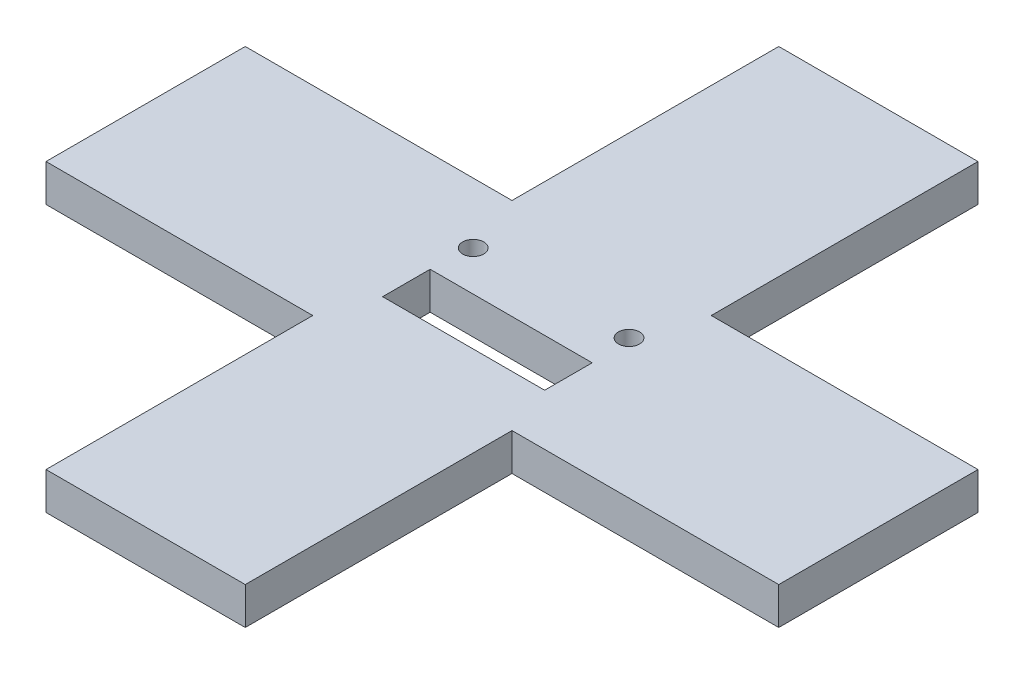
ISO-10303-21;
HEADER;
FILE_DESCRIPTION(('STEP AP214'),'2;1');
FILE_NAME('part.step','',(''),(''),'','','');
FILE_SCHEMA(('AUTOMOTIVE_DESIGN { 1 0 10303 214 1 1 1 1 }'));
ENDSEC;
DATA;
#1=APPLICATION_CONTEXT('core data for automotive mechanical design processes');
#2=APPLICATION_PROTOCOL_DEFINITION('international standard','automotive_design',2000,#1);
#3=PRODUCT_CONTEXT('',#1,'mechanical');
#4=PRODUCT('Part','Part','',(#3));
#5=PRODUCT_RELATED_PRODUCT_CATEGORY('part','',(#4));
#6=PRODUCT_DEFINITION_FORMATION('','',#4);
#7=PRODUCT_DEFINITION_CONTEXT('part definition',#1,'design');
#8=PRODUCT_DEFINITION('design','',#6,#7);
#9=PRODUCT_DEFINITION_SHAPE('','',#8);
#10=(LENGTH_UNIT() NAMED_UNIT(*) SI_UNIT(.MILLI.,.METRE.));
#11=(NAMED_UNIT(*) PLANE_ANGLE_UNIT() SI_UNIT($,.RADIAN.));
#12=(NAMED_UNIT(*) SI_UNIT($,.STERADIAN.) SOLID_ANGLE_UNIT());
#13=UNCERTAINTY_MEASURE_WITH_UNIT(LENGTH_MEASURE(1.E-05),#10,'distance_accuracy_value','');
#14=(GEOMETRIC_REPRESENTATION_CONTEXT(3) GLOBAL_UNCERTAINTY_ASSIGNED_CONTEXT((#13)) GLOBAL_UNIT_ASSIGNED_CONTEXT((#10,
#11,#12)) REPRESENTATION_CONTEXT('',''));
#15=CARTESIAN_POINT('',(0.,0.,0.));
#16=DIRECTION('',(0.,0.,1.));
#17=DIRECTION('',(1.,0.,0.));
#18=AXIS2_PLACEMENT_3D('',#15,#16,#17);
#19=CARTESIAN_POINT('',(0.,6.,0.));
#20=DIRECTION('',(0.,1.,0.));
#21=DIRECTION('',(0.,0.,1.));
#22=AXIS2_PLACEMENT_3D('',#19,#20,#21);
#23=PLANE('',#22);
#24=CARTESIAN_POINT('',(-12.56,6.,-6.44));
#25=DIRECTION('',(0.,1.,0.));
#26=DIRECTION('',(0.,0.,1.));
#27=AXIS2_PLACEMENT_3D('',#24,#25,#26);
#28=CIRCLE('',#27,1.7);
#29=CARTESIAN_POINT('',(-12.56,6.,-4.74));
#30=VERTEX_POINT('',#29);
#31=EDGE_CURVE('E188',#30,#30,#28,.T.);
#32=ORIENTED_EDGE('',*,*,#31,.F.);
#33=EDGE_LOOP('',(#32));
#34=FACE_BOUND('',#33,.T.);
#35=DIRECTION('',(-1.,0.,0.));
#36=VECTOR('',#35,1.);
#37=CARTESIAN_POINT('',(16.0572409144759,6.,-59.199662960896));
#38=LINE('',#37,#36);
#39=CARTESIAN_POINT('',(16.0572409144759,6.,-59.199662960896));
#40=VERTEX_POINT('',#39);
#41=CARTESIAN_POINT('',(-16.0627590855242,6.,-59.199662960896));
#42=VERTEX_POINT('',#41);
#43=EDGE_CURVE('E204',#40,#42,#38,.T.);
#44=ORIENTED_EDGE('',*,*,#43,.T.);
#45=DIRECTION('',(0.,0.,1.));
#46=VECTOR('',#45,1.);
#47=CARTESIAN_POINT('',(-16.0627590855242,6.,-59.199662960896));
#48=LINE('',#47,#46);
#49=CARTESIAN_POINT('',(-16.0627590855241,6.,-16.199662960896));
#50=VERTEX_POINT('',#49);
#51=EDGE_CURVE('E207',#42,#50,#48,.T.);
#52=ORIENTED_EDGE('',*,*,#51,.T.);
#53=DIRECTION('',(-1.,0.,0.));
#54=VECTOR('',#53,1.);
#55=CARTESIAN_POINT('',(-16.0627590855241,6.,-16.199662960896));
#56=LINE('',#55,#54);
#57=CARTESIAN_POINT('',(-59.0627590855241,6.,-16.199662960896));
#58=VERTEX_POINT('',#57);
#59=EDGE_CURVE('E211',#50,#58,#56,.T.);
#60=ORIENTED_EDGE('',*,*,#59,.T.);
#61=DIRECTION('',(0.,0.,1.));
#62=VECTOR('',#61,1.);
#63=CARTESIAN_POINT('',(-59.0627590855241,6.,-0.13966296089599));
#64=LINE('',#63,#62);
#65=CARTESIAN_POINT('',(-59.0627590855241,6.,15.920337039104));
#66=VERTEX_POINT('',#65);
#67=EDGE_CURVE('E214',#58,#66,#64,.T.);
#68=ORIENTED_EDGE('',*,*,#67,.T.);
#69=DIRECTION('',(1.,0.,0.));
#70=VECTOR('',#69,1.);
#71=CARTESIAN_POINT('',(-59.0627590855241,6.,15.920337039104));
#72=LINE('',#71,#70);
#73=CARTESIAN_POINT('',(-16.0627590855241,6.,15.920337039104));
#74=VERTEX_POINT('',#73);
#75=EDGE_CURVE('E217',#66,#74,#72,.T.);
#76=ORIENTED_EDGE('',*,*,#75,.T.);
#77=DIRECTION('',(0.,0.,1.));
#78=VECTOR('',#77,1.);
#79=CARTESIAN_POINT('',(-16.0627590855241,6.,15.920337039104));
#80=LINE('',#79,#78);
#81=CARTESIAN_POINT('',(-16.0627590855241,6.,58.920337039104));
#82=VERTEX_POINT('',#81);
#83=EDGE_CURVE('E220',#74,#82,#80,.T.);
#84=ORIENTED_EDGE('',*,*,#83,.T.);
#85=DIRECTION('',(1.,0.,0.));
#86=VECTOR('',#85,1.);
#87=CARTESIAN_POINT('',(-16.0627590855241,6.,58.920337039104));
#88=LINE('',#87,#86);
#89=CARTESIAN_POINT('',(16.0572409144759,6.,58.920337039104));
#90=VERTEX_POINT('',#89);
#91=EDGE_CURVE('E223',#82,#90,#88,.T.);
#92=ORIENTED_EDGE('',*,*,#91,.T.);
#93=DIRECTION('',(0.,0.,-1.));
#94=VECTOR('',#93,1.);
#95=CARTESIAN_POINT('',(16.0572409144759,6.,58.920337039104));
#96=LINE('',#95,#94);
#97=CARTESIAN_POINT('',(16.0572409144759,6.,15.920337039104));
#98=VERTEX_POINT('',#97);
#99=EDGE_CURVE('E226',#90,#98,#96,.T.);
#100=ORIENTED_EDGE('',*,*,#99,.T.);
#101=DIRECTION('',(1.,0.,0.));
#102=VECTOR('',#101,1.);
#103=CARTESIAN_POINT('',(16.0572409144759,6.,15.920337039104));
#104=LINE('',#103,#102);
#105=CARTESIAN_POINT('',(59.0572409144759,6.,15.920337039104));
#106=VERTEX_POINT('',#105);
#107=EDGE_CURVE('E229',#98,#106,#104,.T.);
#108=ORIENTED_EDGE('',*,*,#107,.T.);
#109=DIRECTION('',(0.,0.,-1.));
#110=VECTOR('',#109,1.);
#111=CARTESIAN_POINT('',(59.0572409144759,6.,-0.139662960895987));
#112=LINE('',#111,#110);
#113=CARTESIAN_POINT('',(59.0572409144759,6.,-16.199662960896));
#114=VERTEX_POINT('',#113);
#115=EDGE_CURVE('E232',#106,#114,#112,.T.);
#116=ORIENTED_EDGE('',*,*,#115,.T.);
#117=DIRECTION('',(-1.,0.,0.));
#118=VECTOR('',#117,1.);
#119=CARTESIAN_POINT('',(59.0572409144759,6.,-16.199662960896));
#120=LINE('',#119,#118);
#121=CARTESIAN_POINT('',(16.0572409144759,6.,-16.199662960896));
#122=VERTEX_POINT('',#121);
#123=EDGE_CURVE('E235',#114,#122,#120,.T.);
#124=ORIENTED_EDGE('',*,*,#123,.T.);
#125=DIRECTION('',(0.,0.,-1.));
#126=VECTOR('',#125,1.);
#127=CARTESIAN_POINT('',(16.0572409144759,6.,-16.199662960896));
#128=LINE('',#127,#126);
#129=EDGE_CURVE('E238',#122,#40,#128,.T.);
#130=ORIENTED_EDGE('',*,*,#129,.T.);
#131=EDGE_LOOP('',(#44,#52,#60,#68,#76,#84,#92,#100,#108,#116,#124,#130));
#132=FACE_BOUND('',#131,.T.);
#133=DIRECTION('',(1.,0.,0.));
#134=VECTOR('',#133,1.);
#135=CARTESIAN_POINT('',(13.06,6.,7.66));
#136=LINE('',#135,#134);
#137=CARTESIAN_POINT('',(-13.06,6.,7.66));
#138=VERTEX_POINT('',#137);
#139=CARTESIAN_POINT('',(13.06,6.,7.66));
#140=VERTEX_POINT('',#139);
#141=EDGE_CURVE('E162',#138,#140,#136,.T.);
#142=ORIENTED_EDGE('',*,*,#141,.F.);
#143=DIRECTION('',(0.,0.,1.));
#144=VECTOR('',#143,1.);
#145=CARTESIAN_POINT('',(-13.06,6.,7.66));
#146=LINE('',#145,#144);
#147=CARTESIAN_POINT('',(-13.06,6.,0.));
#148=VERTEX_POINT('',#147);
#149=EDGE_CURVE('E153',#148,#138,#146,.T.);
#150=ORIENTED_EDGE('',*,*,#149,.F.);
#151=DIRECTION('',(-1.,0.,0.));
#152=VECTOR('',#151,1.);
#153=CARTESIAN_POINT('',(13.06,6.,0.));
#154=LINE('',#153,#152);
#155=CARTESIAN_POINT('',(13.06,6.,0.));
#156=VERTEX_POINT('',#155);
#157=EDGE_CURVE('E180',#156,#148,#154,.T.);
#158=ORIENTED_EDGE('',*,*,#157,.F.);
#159=DIRECTION('',(0.,0.,-1.));
#160=VECTOR('',#159,1.);
#161=CARTESIAN_POINT('',(13.06,6.,7.66));
#162=LINE('',#161,#160);
#163=EDGE_CURVE('E176',#140,#156,#162,.T.);
#164=ORIENTED_EDGE('',*,*,#163,.F.);
#165=EDGE_LOOP('',(#142,#150,#158,#164));
#166=FACE_BOUND('',#165,.T.);
#167=CARTESIAN_POINT('',(12.56,6.,-6.44));
#168=DIRECTION('',(0.,1.,0.));
#169=DIRECTION('',(0.,0.,1.));
#170=AXIS2_PLACEMENT_3D('',#167,#168,#169);
#171=CIRCLE('',#170,1.7);
#172=CARTESIAN_POINT('',(12.56,6.,-4.74));
#173=VERTEX_POINT('',#172);
#174=EDGE_CURVE('E561',#173,#173,#171,.T.);
#175=ORIENTED_EDGE('',*,*,#174,.F.);
#176=EDGE_LOOP('',(#175));
#177=FACE_BOUND('',#176,.T.);
#178=ADVANCED_FACE('F39',(#34,#132,#166,#177),#23,.T.);
#179=CARTESIAN_POINT('',(0.,0.,0.));
#180=DIRECTION('',(0.,1.,0.));
#181=DIRECTION('',(0.,0.,1.));
#182=AXIS2_PLACEMENT_3D('',#179,#180,#181);
#183=PLANE('',#182);
#184=DIRECTION('',(-1.,0.,0.));
#185=VECTOR('',#184,1.);
#186=CARTESIAN_POINT('',(-0.00275908552412399,0.,-59.199662960896));
#187=LINE('',#186,#185);
#188=CARTESIAN_POINT('',(16.0572409144759,0.,-59.199662960896));
#189=VERTEX_POINT('',#188);
#190=CARTESIAN_POINT('',(-16.0627590855242,0.,-59.199662960896));
#191=VERTEX_POINT('',#190);
#192=EDGE_CURVE('E171',#189,#191,#187,.T.);
#193=ORIENTED_EDGE('',*,*,#192,.F.);
#194=DIRECTION('',(0.,0.,-1.));
#195=VECTOR('',#194,1.);
#196=CARTESIAN_POINT('',(16.0572409144759,0.,-16.199662960896));
#197=LINE('',#196,#195);
#198=CARTESIAN_POINT('',(16.0572409144759,0.,-16.199662960896));
#199=VERTEX_POINT('',#198);
#200=EDGE_CURVE('E208',#199,#189,#197,.T.);
#201=ORIENTED_EDGE('',*,*,#200,.F.);
#202=DIRECTION('',(-1.,0.,0.));
#203=VECTOR('',#202,1.);
#204=CARTESIAN_POINT('',(59.0572409144759,0.,-16.199662960896));
#205=LINE('',#204,#203);
#206=CARTESIAN_POINT('',(59.0572409144759,0.,-16.199662960896));
#207=VERTEX_POINT('',#206);
#208=EDGE_CURVE('E274',#207,#199,#205,.T.);
#209=ORIENTED_EDGE('',*,*,#208,.F.);
#210=DIRECTION('',(0.,0.,-1.));
#211=VECTOR('',#210,1.);
#212=CARTESIAN_POINT('',(59.0572409144759,0.,-0.139662960895987));
#213=LINE('',#212,#211);
#214=CARTESIAN_POINT('',(59.0572409144759,0.,15.920337039104));
#215=VERTEX_POINT('',#214);
#216=EDGE_CURVE('E271',#215,#207,#213,.T.);
#217=ORIENTED_EDGE('',*,*,#216,.F.);
#218=DIRECTION('',(1.,0.,0.));
#219=VECTOR('',#218,1.);
#220=CARTESIAN_POINT('',(16.0572409144759,0.,15.920337039104));
#221=LINE('',#220,#219);
#222=CARTESIAN_POINT('',(16.0572409144759,0.,15.920337039104));
#223=VERTEX_POINT('',#222);
#224=EDGE_CURVE('E267',#223,#215,#221,.T.);
#225=ORIENTED_EDGE('',*,*,#224,.F.);
#226=DIRECTION('',(0.,0.,-1.));
#227=VECTOR('',#226,1.);
#228=CARTESIAN_POINT('',(16.0572409144759,0.,58.920337039104));
#229=LINE('',#228,#227);
#230=CARTESIAN_POINT('',(16.0572409144759,0.,58.920337039104));
#231=VERTEX_POINT('',#230);
#232=EDGE_CURVE('E264',#231,#223,#229,.T.);
#233=ORIENTED_EDGE('',*,*,#232,.F.);
#234=DIRECTION('',(1.,0.,0.));
#235=VECTOR('',#234,1.);
#236=CARTESIAN_POINT('',(-0.00275908552412399,0.,58.920337039104));
#237=LINE('',#236,#235);
#238=CARTESIAN_POINT('',(-16.0627590855241,0.,58.920337039104));
#239=VERTEX_POINT('',#238);
#240=EDGE_CURVE('E261',#239,#231,#237,.T.);
#241=ORIENTED_EDGE('',*,*,#240,.F.);
#242=DIRECTION('',(0.,0.,1.));
#243=VECTOR('',#242,1.);
#244=CARTESIAN_POINT('',(-16.0627590855241,0.,15.920337039104));
#245=LINE('',#244,#243);
#246=CARTESIAN_POINT('',(-16.0627590855241,0.,15.920337039104));
#247=VERTEX_POINT('',#246);
#248=EDGE_CURVE('E257',#247,#239,#245,.T.);
#249=ORIENTED_EDGE('',*,*,#248,.F.);
#250=DIRECTION('',(1.,0.,0.));
#251=VECTOR('',#250,1.);
#252=CARTESIAN_POINT('',(-59.0627590855241,0.,15.920337039104));
#253=LINE('',#252,#251);
#254=CARTESIAN_POINT('',(-59.0627590855241,0.,15.920337039104));
#255=VERTEX_POINT('',#254);
#256=EDGE_CURVE('E254',#255,#247,#253,.T.);
#257=ORIENTED_EDGE('',*,*,#256,.F.);
#258=DIRECTION('',(0.,0.,1.));
#259=VECTOR('',#258,1.);
#260=CARTESIAN_POINT('',(-59.0627590855241,0.,15.920337039104));
#261=LINE('',#260,#259);
#262=CARTESIAN_POINT('',(-59.0627590855241,0.,-16.199662960896));
#263=VERTEX_POINT('',#262);
#264=EDGE_CURVE('E251',#263,#255,#261,.T.);
#265=ORIENTED_EDGE('',*,*,#264,.F.);
#266=DIRECTION('',(-1.,0.,0.));
#267=VECTOR('',#266,1.);
#268=CARTESIAN_POINT('',(-16.0627590855241,0.,-16.199662960896));
#269=LINE('',#268,#267);
#270=CARTESIAN_POINT('',(-16.0627590855241,0.,-16.199662960896));
#271=VERTEX_POINT('',#270);
#272=EDGE_CURVE('E247',#271,#263,#269,.T.);
#273=ORIENTED_EDGE('',*,*,#272,.F.);
#274=DIRECTION('',(0.,0.,1.));
#275=VECTOR('',#274,1.);
#276=CARTESIAN_POINT('',(-16.0627590855242,0.,-59.199662960896));
#277=LINE('',#276,#275);
#278=EDGE_CURVE('E244',#191,#271,#277,.T.);
#279=ORIENTED_EDGE('',*,*,#278,.F.);
#280=EDGE_LOOP('',(#193,#201,#209,#217,#225,#233,#241,#249,#257,#265,#273,#279));
#281=FACE_BOUND('',#280,.T.);
#282=DIRECTION('',(0.,0.,1.));
#283=VECTOR('',#282,1.);
#284=CARTESIAN_POINT('',(-13.06,0.,7.66));
#285=LINE('',#284,#283);
#286=CARTESIAN_POINT('',(-13.06,0.,0.));
#287=VERTEX_POINT('',#286);
#288=CARTESIAN_POINT('',(-13.06,0.,7.66));
#289=VERTEX_POINT('',#288);
#290=EDGE_CURVE('E63',#287,#289,#285,.T.);
#291=ORIENTED_EDGE('',*,*,#290,.T.);
#292=DIRECTION('',(1.,0.,0.));
#293=VECTOR('',#292,1.);
#294=CARTESIAN_POINT('',(13.06,0.,7.66));
#295=LINE('',#294,#293);
#296=CARTESIAN_POINT('',(13.06,0.,7.66));
#297=VERTEX_POINT('',#296);
#298=EDGE_CURVE('E169',#289,#297,#295,.T.);
#299=ORIENTED_EDGE('',*,*,#298,.T.);
#300=DIRECTION('',(0.,0.,-1.));
#301=VECTOR('',#300,1.);
#302=CARTESIAN_POINT('',(13.06,0.,7.66));
#303=LINE('',#302,#301);
#304=CARTESIAN_POINT('',(13.06,0.,0.));
#305=VERTEX_POINT('',#304);
#306=EDGE_CURVE('E191',#297,#305,#303,.T.);
#307=ORIENTED_EDGE('',*,*,#306,.T.);
#308=DIRECTION('',(-1.,0.,0.));
#309=VECTOR('',#308,1.);
#310=CARTESIAN_POINT('',(13.06,0.,0.));
#311=LINE('',#310,#309);
#312=EDGE_CURVE('E163',#305,#287,#311,.T.);
#313=ORIENTED_EDGE('',*,*,#312,.T.);
#314=EDGE_LOOP('',(#291,#299,#307,#313));
#315=FACE_BOUND('',#314,.T.);
#316=CARTESIAN_POINT('',(-12.56,0.,-6.44));
#317=DIRECTION('',(0.,1.,0.));
#318=DIRECTION('',(0.,0.,1.));
#319=AXIS2_PLACEMENT_3D('',#316,#317,#318);
#320=CIRCLE('',#319,1.7);
#321=CARTESIAN_POINT('',(-12.56,0.,-4.74));
#322=VERTEX_POINT('',#321);
#323=EDGE_CURVE('E569',#322,#322,#320,.T.);
#324=ORIENTED_EDGE('',*,*,#323,.T.);
#325=EDGE_LOOP('',(#324));
#326=FACE_BOUND('',#325,.T.);
#327=CARTESIAN_POINT('',(12.56,0.,-6.44));
#328=DIRECTION('',(0.,1.,0.));
#329=DIRECTION('',(0.,0.,1.));
#330=AXIS2_PLACEMENT_3D('',#327,#328,#329);
#331=CIRCLE('',#330,1.7);
#332=CARTESIAN_POINT('',(12.56,0.,-4.74));
#333=VERTEX_POINT('',#332);
#334=EDGE_CURVE('E564',#333,#333,#331,.T.);
#335=ORIENTED_EDGE('',*,*,#334,.T.);
#336=EDGE_LOOP('',(#335));
#337=FACE_BOUND('',#336,.T.);
#338=ADVANCED_FACE('F330',(#281,#315,#326,#337),#183,.F.);
#339=CARTESIAN_POINT('',(-0.00275908552412399,6.,-59.199662960896));
#340=DIRECTION('',(0.,0.,1.));
#341=DIRECTION('',(1.,0.,0.));
#342=AXIS2_PLACEMENT_3D('',#339,#340,#341);
#343=PLANE('',#342);
#344=ORIENTED_EDGE('',*,*,#192,.T.);
#345=DIRECTION('',(0.,-1.,0.));
#346=VECTOR('',#345,1.);
#347=CARTESIAN_POINT('',(-16.0627590855242,6.,-59.199662960896));
#348=LINE('',#347,#346);
#349=EDGE_CURVE('E11',#42,#191,#348,.T.);
#350=ORIENTED_EDGE('',*,*,#349,.F.);
#351=ORIENTED_EDGE('',*,*,#43,.F.);
#352=DIRECTION('',(0.,-1.,0.));
#353=VECTOR('',#352,1.);
#354=CARTESIAN_POINT('',(16.0572409144759,6.,-59.199662960896));
#355=LINE('',#354,#353);
#356=EDGE_CURVE('E241',#40,#189,#355,.T.);
#357=ORIENTED_EDGE('',*,*,#356,.T.);
#358=EDGE_LOOP('',(#344,#350,#351,#357));
#359=FACE_BOUND('',#358,.T.);
#360=ADVANCED_FACE('F41',(#359),#343,.F.);
#361=CARTESIAN_POINT('',(-16.0627590855242,6.,-59.199662960896));
#362=DIRECTION('',(1.,0.,0.));
#363=DIRECTION('',(0.,0.,-1.));
#364=AXIS2_PLACEMENT_3D('',#361,#362,#363);
#365=PLANE('',#364);
#366=ORIENTED_EDGE('',*,*,#278,.T.);
#367=DIRECTION('',(0.,-1.,0.));
#368=VECTOR('',#367,1.);
#369=CARTESIAN_POINT('',(-16.0627590855241,6.,-16.199662960896));
#370=LINE('',#369,#368);
#371=EDGE_CURVE('E48',#50,#271,#370,.T.);
#372=ORIENTED_EDGE('',*,*,#371,.F.);
#373=ORIENTED_EDGE('',*,*,#51,.F.);
#374=ORIENTED_EDGE('',*,*,#349,.T.);
#375=EDGE_LOOP('',(#366,#372,#373,#374));
#376=FACE_BOUND('',#375,.T.);
#377=ADVANCED_FACE('F347',(#376),#365,.F.);
#378=CARTESIAN_POINT('',(-16.0627590855241,6.,-16.199662960896));
#379=DIRECTION('',(0.,0.,1.));
#380=DIRECTION('',(1.,0.,0.));
#381=AXIS2_PLACEMENT_3D('',#378,#379,#380);
#382=PLANE('',#381);
#383=ORIENTED_EDGE('',*,*,#272,.T.);
#384=DIRECTION('',(0.,-1.,0.));
#385=VECTOR('',#384,1.);
#386=CARTESIAN_POINT('',(-59.0627590855241,6.,-16.199662960896));
#387=LINE('',#386,#385);
#388=EDGE_CURVE('E315',#58,#263,#387,.T.);
#389=ORIENTED_EDGE('',*,*,#388,.F.);
#390=ORIENTED_EDGE('',*,*,#59,.F.);
#391=ORIENTED_EDGE('',*,*,#371,.T.);
#392=EDGE_LOOP('',(#383,#389,#390,#391));
#393=FACE_BOUND('',#392,.T.);
#394=ADVANCED_FACE('F324',(#393),#382,.F.);
#395=CARTESIAN_POINT('',(-59.0627590855241,6.,15.920337039104));
#396=DIRECTION('',(1.,0.,0.));
#397=DIRECTION('',(0.,0.,-1.));
#398=AXIS2_PLACEMENT_3D('',#395,#396,#397);
#399=PLANE('',#398);
#400=ORIENTED_EDGE('',*,*,#264,.T.);
#401=DIRECTION('',(0.,-1.,0.));
#402=VECTOR('',#401,1.);
#403=CARTESIAN_POINT('',(-59.0627590855241,6.,15.920337039104));
#404=LINE('',#403,#402);
#405=EDGE_CURVE('E311',#66,#255,#404,.T.);
#406=ORIENTED_EDGE('',*,*,#405,.F.);
#407=ORIENTED_EDGE('',*,*,#67,.F.);
#408=ORIENTED_EDGE('',*,*,#388,.T.);
#409=EDGE_LOOP('',(#400,#406,#407,#408));
#410=FACE_BOUND('',#409,.T.);
#411=ADVANCED_FACE('F336',(#410),#399,.F.);
#412=CARTESIAN_POINT('',(-59.0627590855241,6.,15.920337039104));
#413=DIRECTION('',(0.,0.,-1.));
#414=DIRECTION('',(-1.,0.,0.));
#415=AXIS2_PLACEMENT_3D('',#412,#413,#414);
#416=PLANE('',#415);
#417=ORIENTED_EDGE('',*,*,#256,.T.);
#418=DIRECTION('',(0.,-1.,0.));
#419=VECTOR('',#418,1.);
#420=CARTESIAN_POINT('',(-16.0627590855241,6.,15.920337039104));
#421=LINE('',#420,#419);
#422=EDGE_CURVE('E307',#74,#247,#421,.T.);
#423=ORIENTED_EDGE('',*,*,#422,.F.);
#424=ORIENTED_EDGE('',*,*,#75,.F.);
#425=ORIENTED_EDGE('',*,*,#405,.T.);
#426=EDGE_LOOP('',(#417,#423,#424,#425));
#427=FACE_BOUND('',#426,.T.);
#428=ADVANCED_FACE('F340',(#427),#416,.F.);
#429=CARTESIAN_POINT('',(-16.0627590855241,6.,15.920337039104));
#430=DIRECTION('',(1.,0.,0.));
#431=DIRECTION('',(0.,0.,-1.));
#432=AXIS2_PLACEMENT_3D('',#429,#430,#431);
#433=PLANE('',#432);
#434=ORIENTED_EDGE('',*,*,#248,.T.);
#435=DIRECTION('',(0.,-1.,0.));
#436=VECTOR('',#435,1.);
#437=CARTESIAN_POINT('',(-16.0627590855241,6.,58.920337039104));
#438=LINE('',#437,#436);
#439=EDGE_CURVE('E303',#82,#239,#438,.T.);
#440=ORIENTED_EDGE('',*,*,#439,.F.);
#441=ORIENTED_EDGE('',*,*,#83,.F.);
#442=ORIENTED_EDGE('',*,*,#422,.T.);
#443=EDGE_LOOP('',(#434,#440,#441,#442));
#444=FACE_BOUND('',#443,.T.);
#445=ADVANCED_FACE('F377',(#444),#433,.F.);
#446=CARTESIAN_POINT('',(-0.00275908552412399,6.,58.920337039104));
#447=DIRECTION('',(0.,0.,-1.));
#448=DIRECTION('',(-1.,0.,0.));
#449=AXIS2_PLACEMENT_3D('',#446,#447,#448);
#450=PLANE('',#449);
#451=ORIENTED_EDGE('',*,*,#240,.T.);
#452=DIRECTION('',(0.,-1.,0.));
#453=VECTOR('',#452,1.);
#454=CARTESIAN_POINT('',(16.0572409144759,6.,58.920337039104));
#455=LINE('',#454,#453);
#456=EDGE_CURVE('E299',#90,#231,#455,.T.);
#457=ORIENTED_EDGE('',*,*,#456,.F.);
#458=ORIENTED_EDGE('',*,*,#91,.F.);
#459=ORIENTED_EDGE('',*,*,#439,.T.);
#460=EDGE_LOOP('',(#451,#457,#458,#459));
#461=FACE_BOUND('',#460,.T.);
#462=ADVANCED_FACE('F378',(#461),#450,.F.);
#463=CARTESIAN_POINT('',(16.0572409144759,6.,58.920337039104));
#464=DIRECTION('',(-1.,0.,0.));
#465=DIRECTION('',(0.,0.,1.));
#466=AXIS2_PLACEMENT_3D('',#463,#464,#465);
#467=PLANE('',#466);
#468=ORIENTED_EDGE('',*,*,#232,.T.);
#469=DIRECTION('',(0.,-1.,0.));
#470=VECTOR('',#469,1.);
#471=CARTESIAN_POINT('',(16.0572409144759,6.,15.920337039104));
#472=LINE('',#471,#470);
#473=EDGE_CURVE('E295',#98,#223,#472,.T.);
#474=ORIENTED_EDGE('',*,*,#473,.F.);
#475=ORIENTED_EDGE('',*,*,#99,.F.);
#476=ORIENTED_EDGE('',*,*,#456,.T.);
#477=EDGE_LOOP('',(#468,#474,#475,#476));
#478=FACE_BOUND('',#477,.T.);
#479=ADVANCED_FACE('F374',(#478),#467,.F.);
#480=CARTESIAN_POINT('',(16.0572409144759,6.,15.920337039104));
#481=DIRECTION('',(0.,0.,-1.));
#482=DIRECTION('',(-1.,0.,0.));
#483=AXIS2_PLACEMENT_3D('',#480,#481,#482);
#484=PLANE('',#483);
#485=ORIENTED_EDGE('',*,*,#224,.T.);
#486=DIRECTION('',(0.,-1.,0.));
#487=VECTOR('',#486,1.);
#488=CARTESIAN_POINT('',(59.0572409144759,6.,15.920337039104));
#489=LINE('',#488,#487);
#490=EDGE_CURVE('E291',#106,#215,#489,.T.);
#491=ORIENTED_EDGE('',*,*,#490,.F.);
#492=ORIENTED_EDGE('',*,*,#107,.F.);
#493=ORIENTED_EDGE('',*,*,#473,.T.);
#494=EDGE_LOOP('',(#485,#491,#492,#493));
#495=FACE_BOUND('',#494,.T.);
#496=ADVANCED_FACE('F365',(#495),#484,.F.);
#497=CARTESIAN_POINT('',(59.0572409144759,6.,-0.139662960895987));
#498=DIRECTION('',(-1.,0.,0.));
#499=DIRECTION('',(0.,0.,1.));
#500=AXIS2_PLACEMENT_3D('',#497,#498,#499);
#501=PLANE('',#500);
#502=ORIENTED_EDGE('',*,*,#216,.T.);
#503=DIRECTION('',(0.,-1.,0.));
#504=VECTOR('',#503,1.);
#505=CARTESIAN_POINT('',(59.0572409144759,6.,-16.199662960896));
#506=LINE('',#505,#504);
#507=EDGE_CURVE('E287',#114,#207,#506,.T.);
#508=ORIENTED_EDGE('',*,*,#507,.F.);
#509=ORIENTED_EDGE('',*,*,#115,.F.);
#510=ORIENTED_EDGE('',*,*,#490,.T.);
#511=EDGE_LOOP('',(#502,#508,#509,#510));
#512=FACE_BOUND('',#511,.T.);
#513=ADVANCED_FACE('F369',(#512),#501,.F.);
#514=CARTESIAN_POINT('',(59.0572409144759,6.,-16.199662960896));
#515=DIRECTION('',(0.,0.,1.));
#516=DIRECTION('',(1.,0.,0.));
#517=AXIS2_PLACEMENT_3D('',#514,#515,#516);
#518=PLANE('',#517);
#519=ORIENTED_EDGE('',*,*,#208,.T.);
#520=DIRECTION('',(0.,-1.,0.));
#521=VECTOR('',#520,1.);
#522=CARTESIAN_POINT('',(16.0572409144759,6.,-16.199662960896));
#523=LINE('',#522,#521);
#524=EDGE_CURVE('E283',#122,#199,#523,.T.);
#525=ORIENTED_EDGE('',*,*,#524,.F.);
#526=ORIENTED_EDGE('',*,*,#123,.F.);
#527=ORIENTED_EDGE('',*,*,#507,.T.);
#528=EDGE_LOOP('',(#519,#525,#526,#527));
#529=FACE_BOUND('',#528,.T.);
#530=ADVANCED_FACE('F358',(#529),#518,.F.);
#531=CARTESIAN_POINT('',(16.0572409144759,6.,-16.199662960896));
#532=DIRECTION('',(-1.,0.,0.));
#533=DIRECTION('',(0.,0.,1.));
#534=AXIS2_PLACEMENT_3D('',#531,#532,#533);
#535=PLANE('',#534);
#536=ORIENTED_EDGE('',*,*,#200,.T.);
#537=ORIENTED_EDGE('',*,*,#356,.F.);
#538=ORIENTED_EDGE('',*,*,#129,.F.);
#539=ORIENTED_EDGE('',*,*,#524,.T.);
#540=EDGE_LOOP('',(#536,#537,#538,#539));
#541=FACE_BOUND('',#540,.T.);
#542=ADVANCED_FACE('F353',(#541),#535,.F.);
#543=CARTESIAN_POINT('',(-13.06,6.,7.66));
#544=DIRECTION('',(1.,0.,0.));
#545=DIRECTION('',(0.,0.,-1.));
#546=AXIS2_PLACEMENT_3D('',#543,#544,#545);
#547=PLANE('',#546);
#548=ORIENTED_EDGE('',*,*,#290,.F.);
#549=DIRECTION('',(0.,-1.,0.));
#550=VECTOR('',#549,1.);
#551=CARTESIAN_POINT('',(-13.06,6.,0.));
#552=LINE('',#551,#550);
#553=EDGE_CURVE('E157',#148,#287,#552,.T.);
#554=ORIENTED_EDGE('',*,*,#553,.F.);
#555=ORIENTED_EDGE('',*,*,#149,.T.);
#556=DIRECTION('',(0.,-1.,0.));
#557=VECTOR('',#556,1.);
#558=CARTESIAN_POINT('',(-13.06,6.,7.66));
#559=LINE('',#558,#557);
#560=EDGE_CURVE('E156',#138,#289,#559,.T.);
#561=ORIENTED_EDGE('',*,*,#560,.T.);
#562=EDGE_LOOP('',(#548,#554,#555,#561));
#563=FACE_BOUND('',#562,.T.);
#564=ADVANCED_FACE('F155',(#563),#547,.T.);
#565=CARTESIAN_POINT('',(13.06,6.,7.66));
#566=DIRECTION('',(0.,0.,-1.));
#567=DIRECTION('',(-1.,0.,0.));
#568=AXIS2_PLACEMENT_3D('',#565,#566,#567);
#569=PLANE('',#568);
#570=ORIENTED_EDGE('',*,*,#298,.F.);
#571=ORIENTED_EDGE('',*,*,#560,.F.);
#572=ORIENTED_EDGE('',*,*,#141,.T.);
#573=DIRECTION('',(0.,-1.,0.));
#574=VECTOR('',#573,1.);
#575=CARTESIAN_POINT('',(13.06,6.,7.66));
#576=LINE('',#575,#574);
#577=EDGE_CURVE('E172',#140,#297,#576,.T.);
#578=ORIENTED_EDGE('',*,*,#577,.T.);
#579=EDGE_LOOP('',(#570,#571,#572,#578));
#580=FACE_BOUND('',#579,.T.);
#581=ADVANCED_FACE('F166',(#580),#569,.T.);
#582=CARTESIAN_POINT('',(13.06,6.,7.66));
#583=DIRECTION('',(-1.,0.,0.));
#584=DIRECTION('',(0.,0.,1.));
#585=AXIS2_PLACEMENT_3D('',#582,#583,#584);
#586=PLANE('',#585);
#587=ORIENTED_EDGE('',*,*,#306,.F.);
#588=ORIENTED_EDGE('',*,*,#577,.F.);
#589=ORIENTED_EDGE('',*,*,#163,.T.);
#590=DIRECTION('',(0.,-1.,0.));
#591=VECTOR('',#590,1.);
#592=CARTESIAN_POINT('',(13.06,6.,0.));
#593=LINE('',#592,#591);
#594=EDGE_CURVE('E55',#156,#305,#593,.T.);
#595=ORIENTED_EDGE('',*,*,#594,.T.);
#596=EDGE_LOOP('',(#587,#588,#589,#595));
#597=FACE_BOUND('',#596,.T.);
#598=ADVANCED_FACE('F432',(#597),#586,.T.);
#599=CARTESIAN_POINT('',(13.06,6.,0.));
#600=DIRECTION('',(0.,0.,1.));
#601=DIRECTION('',(1.,0.,0.));
#602=AXIS2_PLACEMENT_3D('',#599,#600,#601);
#603=PLANE('',#602);
#604=ORIENTED_EDGE('',*,*,#312,.F.);
#605=ORIENTED_EDGE('',*,*,#594,.F.);
#606=ORIENTED_EDGE('',*,*,#157,.T.);
#607=ORIENTED_EDGE('',*,*,#553,.T.);
#608=EDGE_LOOP('',(#604,#605,#606,#607));
#609=FACE_BOUND('',#608,.T.);
#610=ADVANCED_FACE('F438',(#609),#603,.T.);
#611=CARTESIAN_POINT('',(-12.56,6.,-6.44));
#612=DIRECTION('',(0.,-1.,0.));
#613=DIRECTION('',(0.,0.,-1.));
#614=AXIS2_PLACEMENT_3D('',#611,#612,#613);
#615=CYLINDRICAL_SURFACE('',#614,1.7);
#616=ORIENTED_EDGE('',*,*,#31,.T.);
#617=EDGE_LOOP('',(#616));
#618=FACE_BOUND('',#617,.T.);
#619=ORIENTED_EDGE('',*,*,#323,.F.);
#620=EDGE_LOOP('',(#619));
#621=FACE_BOUND('',#620,.T.);
#622=ADVANCED_FACE('F446',(#618,#621),#615,.F.);
#623=CARTESIAN_POINT('',(12.56,6.,-6.44));
#624=DIRECTION('',(0.,-1.,0.));
#625=DIRECTION('',(0.,0.,-1.));
#626=AXIS2_PLACEMENT_3D('',#623,#624,#625);
#627=CYLINDRICAL_SURFACE('',#626,1.7);
#628=ORIENTED_EDGE('',*,*,#174,.T.);
#629=EDGE_LOOP('',(#628));
#630=FACE_BOUND('',#629,.T.);
#631=ORIENTED_EDGE('',*,*,#334,.F.);
#632=EDGE_LOOP('',(#631));
#633=FACE_BOUND('',#632,.T.);
#634=ADVANCED_FACE('F453',(#630,#633),#627,.F.);
#635=CLOSED_SHELL('',(#178,#338,#360,#377,#394,#411,#428,#445,#462,#479,#496,#513,#530,#542,
#564,#581,#598,#610,#622,#634));
#636=MANIFOLD_SOLID_BREP('B2',#635);
#637=ADVANCED_BREP_SHAPE_REPRESENTATION('',(#18,#636),#14);
#638=SHAPE_DEFINITION_REPRESENTATION(#9,#637);
ENDSEC;
END-ISO-10303-21;
